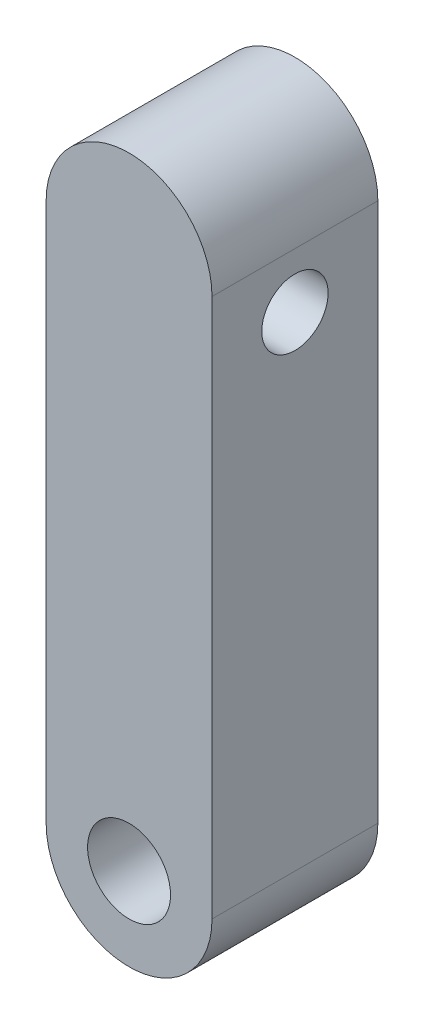
ISO-10303-21;
HEADER;
FILE_DESCRIPTION(('STEP AP214'),'2;1');
FILE_NAME('part.step','',(''),(''),'','','');
FILE_SCHEMA(('AUTOMOTIVE_DESIGN { 1 0 10303 214 1 1 1 1 }'));
ENDSEC;
DATA;
#1=APPLICATION_CONTEXT('core data for automotive mechanical design processes');
#2=APPLICATION_PROTOCOL_DEFINITION('international standard','automotive_design',2000,#1);
#3=PRODUCT_CONTEXT('',#1,'mechanical');
#4=PRODUCT('Part','Part','',(#3));
#5=PRODUCT_RELATED_PRODUCT_CATEGORY('part','',(#4));
#6=PRODUCT_DEFINITION_FORMATION('','',#4);
#7=PRODUCT_DEFINITION_CONTEXT('part definition',#1,'design');
#8=PRODUCT_DEFINITION('design','',#6,#7);
#9=PRODUCT_DEFINITION_SHAPE('','',#8);
#10=(LENGTH_UNIT() NAMED_UNIT(*) SI_UNIT(.MILLI.,.METRE.));
#11=(NAMED_UNIT(*) PLANE_ANGLE_UNIT() SI_UNIT($,.RADIAN.));
#12=(NAMED_UNIT(*) SI_UNIT($,.STERADIAN.) SOLID_ANGLE_UNIT());
#13=UNCERTAINTY_MEASURE_WITH_UNIT(LENGTH_MEASURE(1.E-05),#10,'distance_accuracy_value','');
#14=(GEOMETRIC_REPRESENTATION_CONTEXT(3) GLOBAL_UNCERTAINTY_ASSIGNED_CONTEXT((#13)) GLOBAL_UNIT_ASSIGNED_CONTEXT((#10,
#11,#12)) REPRESENTATION_CONTEXT('',''));
#15=CARTESIAN_POINT('',(0.,0.,0.));
#16=DIRECTION('',(0.,0.,1.));
#17=DIRECTION('',(1.,0.,0.));
#18=AXIS2_PLACEMENT_3D('',#15,#16,#17);
#19=CARTESIAN_POINT('',(0.,0.,20.));
#20=DIRECTION('',(0.,0.,1.));
#21=DIRECTION('',(1.,0.,0.));
#22=AXIS2_PLACEMENT_3D('',#19,#20,#21);
#23=PLANE('',#22);
#24=CARTESIAN_POINT('',(0.,0.,20.));
#25=DIRECTION('',(0.,0.,1.));
#26=DIRECTION('',(1.,0.,0.));
#27=AXIS2_PLACEMENT_3D('',#24,#25,#26);
#28=CIRCLE('',#27,10.);
#29=CARTESIAN_POINT('',(-10.,0.,20.));
#30=VERTEX_POINT('',#29);
#31=CARTESIAN_POINT('',(10.,0.,20.));
#32=VERTEX_POINT('',#31);
#33=EDGE_CURVE('E90',#30,#32,#28,.T.);
#34=ORIENTED_EDGE('',*,*,#33,.T.);
#35=DIRECTION('',(0.,1.,0.));
#36=VECTOR('',#35,1.);
#37=CARTESIAN_POINT('',(10.,0.,20.));
#38=LINE('',#37,#36);
#39=CARTESIAN_POINT('',(10.,65.,20.));
#40=VERTEX_POINT('',#39);
#41=EDGE_CURVE('E85',#32,#40,#38,.T.);
#42=ORIENTED_EDGE('',*,*,#41,.T.);
#43=CARTESIAN_POINT('',(0.,65.,20.));
#44=DIRECTION('',(0.,0.,1.));
#45=DIRECTION('',(1.,0.,0.));
#46=AXIS2_PLACEMENT_3D('',#43,#44,#45);
#47=CIRCLE('',#46,10.);
#48=CARTESIAN_POINT('',(-10.,65.,20.));
#49=VERTEX_POINT('',#48);
#50=EDGE_CURVE('E88',#40,#49,#47,.T.);
#51=ORIENTED_EDGE('',*,*,#50,.T.);
#52=DIRECTION('',(0.,-1.,0.));
#53=VECTOR('',#52,1.);
#54=CARTESIAN_POINT('',(-10.,0.,20.));
#55=LINE('',#54,#53);
#56=EDGE_CURVE('E55',#49,#30,#55,.T.);
#57=ORIENTED_EDGE('',*,*,#56,.T.);
#58=EDGE_LOOP('',(#34,#42,#51,#57));
#59=FACE_BOUND('',#58,.T.);
#60=CARTESIAN_POINT('',(0.,0.,20.));
#61=DIRECTION('',(0.,0.,1.));
#62=DIRECTION('',(1.,0.,0.));
#63=AXIS2_PLACEMENT_3D('',#60,#61,#62);
#64=CIRCLE('',#63,5.);
#65=CARTESIAN_POINT('',(5.,0.,20.));
#66=VERTEX_POINT('',#65);
#67=EDGE_CURVE('E106',#66,#66,#64,.T.);
#68=ORIENTED_EDGE('',*,*,#67,.F.);
#69=EDGE_LOOP('',(#68));
#70=FACE_BOUND('',#69,.T.);
#71=ADVANCED_FACE('F37',(#59,#70),#23,.T.);
#72=CARTESIAN_POINT('',(0.,0.,0.));
#73=DIRECTION('',(0.,0.,1.));
#74=DIRECTION('',(1.,0.,0.));
#75=AXIS2_PLACEMENT_3D('',#72,#73,#74);
#76=PLANE('',#75);
#77=CARTESIAN_POINT('',(0.,0.,0.));
#78=DIRECTION('',(0.,0.,1.));
#79=DIRECTION('',(1.,0.,0.));
#80=AXIS2_PLACEMENT_3D('',#77,#78,#79);
#81=CIRCLE('',#80,10.);
#82=CARTESIAN_POINT('',(-10.,0.,0.));
#83=VERTEX_POINT('',#82);
#84=CARTESIAN_POINT('',(10.,0.,0.));
#85=VERTEX_POINT('',#84);
#86=EDGE_CURVE('E103',#83,#85,#81,.T.);
#87=ORIENTED_EDGE('',*,*,#86,.F.);
#88=DIRECTION('',(0.,-1.,0.));
#89=VECTOR('',#88,1.);
#90=CARTESIAN_POINT('',(-10.,0.,0.));
#91=LINE('',#90,#89);
#92=CARTESIAN_POINT('',(-10.,65.,0.));
#93=VERTEX_POINT('',#92);
#94=EDGE_CURVE('E78',#93,#83,#91,.T.);
#95=ORIENTED_EDGE('',*,*,#94,.F.);
#96=CARTESIAN_POINT('',(0.,65.,0.));
#97=DIRECTION('',(0.,0.,1.));
#98=DIRECTION('',(1.,0.,0.));
#99=AXIS2_PLACEMENT_3D('',#96,#97,#98);
#100=CIRCLE('',#99,10.);
#101=CARTESIAN_POINT('',(10.,65.,0.));
#102=VERTEX_POINT('',#101);
#103=EDGE_CURVE('E72',#102,#93,#100,.T.);
#104=ORIENTED_EDGE('',*,*,#103,.F.);
#105=DIRECTION('',(0.,1.,0.));
#106=VECTOR('',#105,1.);
#107=CARTESIAN_POINT('',(10.,0.,0.));
#108=LINE('',#107,#106);
#109=EDGE_CURVE('E94',#85,#102,#108,.T.);
#110=ORIENTED_EDGE('',*,*,#109,.F.);
#111=EDGE_LOOP('',(#87,#95,#104,#110));
#112=FACE_BOUND('',#111,.T.);
#113=CARTESIAN_POINT('',(0.,0.,0.));
#114=DIRECTION('',(0.,0.,1.));
#115=DIRECTION('',(1.,0.,0.));
#116=AXIS2_PLACEMENT_3D('',#113,#114,#115);
#117=CIRCLE('',#116,5.);
#118=CARTESIAN_POINT('',(5.,0.,0.));
#119=VERTEX_POINT('',#118);
#120=EDGE_CURVE('E118',#119,#119,#117,.T.);
#121=ORIENTED_EDGE('',*,*,#120,.T.);
#122=EDGE_LOOP('',(#121));
#123=FACE_BOUND('',#122,.T.);
#124=ADVANCED_FACE('F114',(#112,#123),#76,.F.);
#125=CARTESIAN_POINT('',(0.,0.,20.));
#126=DIRECTION('',(0.,0.,-1.));
#127=DIRECTION('',(-1.,0.,0.));
#128=AXIS2_PLACEMENT_3D('',#125,#126,#127);
#129=CYLINDRICAL_SURFACE('',#128,10.);
#130=ORIENTED_EDGE('',*,*,#86,.T.);
#131=DIRECTION('',(0.,0.,-1.));
#132=VECTOR('',#131,1.);
#133=CARTESIAN_POINT('',(10.,0.,20.));
#134=LINE('',#133,#132);
#135=EDGE_CURVE('E11',#32,#85,#134,.T.);
#136=ORIENTED_EDGE('',*,*,#135,.F.);
#137=ORIENTED_EDGE('',*,*,#33,.F.);
#138=DIRECTION('',(0.,0.,-1.));
#139=VECTOR('',#138,1.);
#140=CARTESIAN_POINT('',(-10.,0.,20.));
#141=LINE('',#140,#139);
#142=EDGE_CURVE('E99',#30,#83,#141,.T.);
#143=ORIENTED_EDGE('',*,*,#142,.T.);
#144=EDGE_LOOP('',(#130,#136,#137,#143));
#145=FACE_BOUND('',#144,.T.);
#146=ADVANCED_FACE('F39',(#145),#129,.T.);
#147=CARTESIAN_POINT('',(10.,0.,20.));
#148=DIRECTION('',(-1.,0.,0.));
#149=DIRECTION('',(0.,0.,1.));
#150=AXIS2_PLACEMENT_3D('',#147,#148,#149);
#151=PLANE('',#150);
#152=CARTESIAN_POINT('',(10.,58.36,10.));
#153=DIRECTION('',(1.,0.,0.));
#154=DIRECTION('',(0.,0.,-1.));
#155=AXIS2_PLACEMENT_3D('',#152,#153,#154);
#156=CIRCLE('',#155,4.);
#157=CARTESIAN_POINT('',(10.,58.36,6.));
#158=VERTEX_POINT('',#157);
#159=EDGE_CURVE('E123',#158,#158,#156,.T.);
#160=ORIENTED_EDGE('',*,*,#159,.F.);
#161=EDGE_LOOP('',(#160));
#162=FACE_BOUND('',#161,.T.);
#163=ORIENTED_EDGE('',*,*,#109,.T.);
#164=DIRECTION('',(0.,0.,-1.));
#165=VECTOR('',#164,1.);
#166=CARTESIAN_POINT('',(10.,65.,20.));
#167=LINE('',#166,#165);
#168=EDGE_CURVE('E47',#40,#102,#167,.T.);
#169=ORIENTED_EDGE('',*,*,#168,.F.);
#170=ORIENTED_EDGE('',*,*,#41,.F.);
#171=ORIENTED_EDGE('',*,*,#135,.T.);
#172=EDGE_LOOP('',(#163,#169,#170,#171));
#173=FACE_BOUND('',#172,.T.);
#174=ADVANCED_FACE('F93',(#162,#173),#151,.F.);
#175=CARTESIAN_POINT('',(0.,65.,20.));
#176=DIRECTION('',(0.,0.,-1.));
#177=DIRECTION('',(-1.,0.,0.));
#178=AXIS2_PLACEMENT_3D('',#175,#176,#177);
#179=CYLINDRICAL_SURFACE('',#178,10.);
#180=ORIENTED_EDGE('',*,*,#103,.T.);
#181=DIRECTION('',(0.,0.,-1.));
#182=VECTOR('',#181,1.);
#183=CARTESIAN_POINT('',(-10.,65.,20.));
#184=LINE('',#183,#182);
#185=EDGE_CURVE('E95',#49,#93,#184,.T.);
#186=ORIENTED_EDGE('',*,*,#185,.F.);
#187=ORIENTED_EDGE('',*,*,#50,.F.);
#188=ORIENTED_EDGE('',*,*,#168,.T.);
#189=EDGE_LOOP('',(#180,#186,#187,#188));
#190=FACE_BOUND('',#189,.T.);
#191=ADVANCED_FACE('F97',(#190),#179,.T.);
#192=CARTESIAN_POINT('',(-10.,0.,20.));
#193=DIRECTION('',(1.,0.,0.));
#194=DIRECTION('',(0.,0.,-1.));
#195=AXIS2_PLACEMENT_3D('',#192,#193,#194);
#196=PLANE('',#195);
#197=CARTESIAN_POINT('',(-10.,58.36,10.));
#198=DIRECTION('',(1.,0.,0.));
#199=DIRECTION('',(0.,0.,-1.));
#200=AXIS2_PLACEMENT_3D('',#197,#198,#199);
#201=CIRCLE('',#200,4.);
#202=CARTESIAN_POINT('',(-10.,58.36,6.));
#203=VERTEX_POINT('',#202);
#204=EDGE_CURVE('E41',#203,#203,#201,.T.);
#205=ORIENTED_EDGE('',*,*,#204,.T.);
#206=EDGE_LOOP('',(#205));
#207=FACE_BOUND('',#206,.T.);
#208=ORIENTED_EDGE('',*,*,#94,.T.);
#209=ORIENTED_EDGE('',*,*,#142,.F.);
#210=ORIENTED_EDGE('',*,*,#56,.F.);
#211=ORIENTED_EDGE('',*,*,#185,.T.);
#212=EDGE_LOOP('',(#208,#209,#210,#211));
#213=FACE_BOUND('',#212,.T.);
#214=ADVANCED_FACE('F111',(#207,#213),#196,.F.);
#215=CARTESIAN_POINT('',(0.,0.,20.));
#216=DIRECTION('',(0.,0.,-1.));
#217=DIRECTION('',(-1.,0.,0.));
#218=AXIS2_PLACEMENT_3D('',#215,#216,#217);
#219=CYLINDRICAL_SURFACE('',#218,5.);
#220=ORIENTED_EDGE('',*,*,#67,.T.);
#221=EDGE_LOOP('',(#220));
#222=FACE_BOUND('',#221,.T.);
#223=ORIENTED_EDGE('',*,*,#120,.F.);
#224=EDGE_LOOP('',(#223));
#225=FACE_BOUND('',#224,.T.);
#226=ADVANCED_FACE('F133',(#222,#225),#219,.F.);
#227=CARTESIAN_POINT('',(-45.,58.36,10.));
#228=DIRECTION('',(1.,0.,0.));
#229=DIRECTION('',(0.,0.,-1.));
#230=AXIS2_PLACEMENT_3D('',#227,#228,#229);
#231=CYLINDRICAL_SURFACE('',#230,4.);
#232=ORIENTED_EDGE('',*,*,#159,.T.);
#233=EDGE_LOOP('',(#232));
#234=FACE_BOUND('',#233,.T.);
#235=ORIENTED_EDGE('',*,*,#204,.F.);
#236=EDGE_LOOP('',(#235));
#237=FACE_BOUND('',#236,.T.);
#238=ADVANCED_FACE('F131',(#234,#237),#231,.F.);
#239=CLOSED_SHELL('',(#71,#124,#146,#174,#191,#214,#226,#238));
#240=MANIFOLD_SOLID_BREP('B2',#239);
#241=ADVANCED_BREP_SHAPE_REPRESENTATION('',(#18,#240),#14);
#242=SHAPE_DEFINITION_REPRESENTATION(#9,#241);
ENDSEC;
END-ISO-10303-21;
